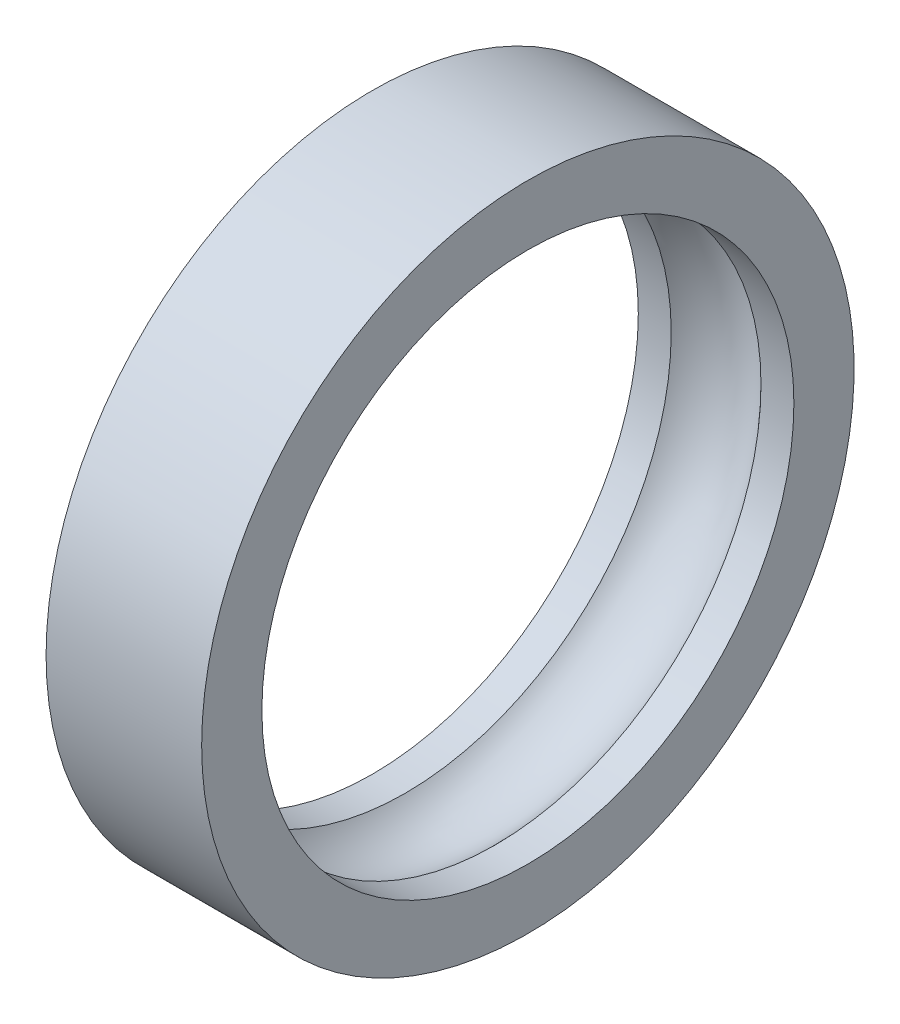
ISO-10303-21;
HEADER;
FILE_DESCRIPTION(('STEP AP214'),'2;1');
FILE_NAME('part.step','',(''),(''),'','','');
FILE_SCHEMA(('AUTOMOTIVE_DESIGN { 1 0 10303 214 1 1 1 1 }'));
ENDSEC;
DATA;
#1=APPLICATION_CONTEXT('core data for automotive mechanical design processes');
#2=APPLICATION_PROTOCOL_DEFINITION('international standard','automotive_design',2000,#1);
#3=PRODUCT_CONTEXT('',#1,'mechanical');
#4=PRODUCT('Part','Part','',(#3));
#5=PRODUCT_RELATED_PRODUCT_CATEGORY('part','',(#4));
#6=PRODUCT_DEFINITION_FORMATION('','',#4);
#7=PRODUCT_DEFINITION_CONTEXT('part definition',#1,'design');
#8=PRODUCT_DEFINITION('design','',#6,#7);
#9=PRODUCT_DEFINITION_SHAPE('','',#8);
#10=(LENGTH_UNIT() NAMED_UNIT(*) SI_UNIT(.MILLI.,.METRE.));
#11=(NAMED_UNIT(*) PLANE_ANGLE_UNIT() SI_UNIT($,.RADIAN.));
#12=(NAMED_UNIT(*) SI_UNIT($,.STERADIAN.) SOLID_ANGLE_UNIT());
#13=UNCERTAINTY_MEASURE_WITH_UNIT(LENGTH_MEASURE(1.E-05),#10,'distance_accuracy_value','');
#14=(GEOMETRIC_REPRESENTATION_CONTEXT(3) GLOBAL_UNCERTAINTY_ASSIGNED_CONTEXT((#13)) GLOBAL_UNIT_ASSIGNED_CONTEXT((#10,
#11,#12)) REPRESENTATION_CONTEXT('',''));
#15=CARTESIAN_POINT('',(0.,0.,0.));
#16=DIRECTION('',(0.,0.,1.));
#17=DIRECTION('',(1.,0.,0.));
#18=AXIS2_PLACEMENT_3D('',#15,#16,#17);
#19=CARTESIAN_POINT('',(-15.5,65.,0.));
#20=DIRECTION('',(1.,0.,0.));
#21=DIRECTION('',(0.,0.,-1.));
#22=AXIS2_PLACEMENT_3D('',#19,#20,#21);
#23=PLANE('',#22);
#24=CARTESIAN_POINT('',(-15.5,0.,0.));
#25=DIRECTION('',(-1.,0.,0.));
#26=DIRECTION('',(0.,0.,1.));
#27=AXIS2_PLACEMENT_3D('',#24,#25,#26);
#28=CIRCLE('',#27,53.);
#29=CARTESIAN_POINT('',(-15.5,0.,53.));
#30=VERTEX_POINT('',#29);
#31=EDGE_CURVE('E53',#30,#30,#28,.T.);
#32=ORIENTED_EDGE('',*,*,#31,.F.);
#33=EDGE_LOOP('',(#32));
#34=FACE_BOUND('',#33,.T.);
#35=CARTESIAN_POINT('',(-15.5,0.,0.));
#36=DIRECTION('',(-1.,0.,0.));
#37=DIRECTION('',(0.,0.,1.));
#38=AXIS2_PLACEMENT_3D('',#35,#36,#37);
#39=CIRCLE('',#38,65.);
#40=CARTESIAN_POINT('',(-15.5,0.,65.));
#41=VERTEX_POINT('',#40);
#42=EDGE_CURVE('E10',#41,#41,#39,.T.);
#43=ORIENTED_EDGE('',*,*,#42,.T.);
#44=EDGE_LOOP('',(#43));
#45=FACE_BOUND('',#44,.T.);
#46=ADVANCED_FACE('F31',(#34,#45),#23,.F.);
#47=CARTESIAN_POINT('',(0.,0.,0.));
#48=DIRECTION('',(-1.,0.,0.));
#49=DIRECTION('',(0.,0.,1.));
#50=AXIS2_PLACEMENT_3D('',#47,#48,#49);
#51=CYLINDRICAL_SURFACE('',#50,65.);
#52=ORIENTED_EDGE('',*,*,#42,.F.);
#53=EDGE_LOOP('',(#52));
#54=FACE_BOUND('',#53,.T.);
#55=CARTESIAN_POINT('',(15.5,0.,0.));
#56=DIRECTION('',(-1.,0.,0.));
#57=DIRECTION('',(0.,0.,1.));
#58=AXIS2_PLACEMENT_3D('',#55,#56,#57);
#59=CIRCLE('',#58,65.);
#60=CARTESIAN_POINT('',(15.5,0.,65.));
#61=VERTEX_POINT('',#60);
#62=EDGE_CURVE('E37',#61,#61,#59,.T.);
#63=ORIENTED_EDGE('',*,*,#62,.T.);
#64=EDGE_LOOP('',(#63));
#65=FACE_BOUND('',#64,.T.);
#66=ADVANCED_FACE('F60',(#54,#65),#51,.T.);
#67=CARTESIAN_POINT('',(15.5,65.,0.));
#68=DIRECTION('',(-1.,0.,0.));
#69=DIRECTION('',(0.,0.,1.));
#70=AXIS2_PLACEMENT_3D('',#67,#68,#69);
#71=PLANE('',#70);
#72=ORIENTED_EDGE('',*,*,#62,.F.);
#73=EDGE_LOOP('',(#72));
#74=FACE_BOUND('',#73,.T.);
#75=CARTESIAN_POINT('',(15.5,0.,0.));
#76=DIRECTION('',(-1.,0.,0.));
#77=DIRECTION('',(0.,0.,1.));
#78=AXIS2_PLACEMENT_3D('',#75,#76,#77);
#79=CIRCLE('',#78,53.);
#80=CARTESIAN_POINT('',(15.5,0.,53.));
#81=VERTEX_POINT('',#80);
#82=EDGE_CURVE('E41',#81,#81,#79,.T.);
#83=ORIENTED_EDGE('',*,*,#82,.T.);
#84=EDGE_LOOP('',(#83));
#85=FACE_BOUND('',#84,.T.);
#86=ADVANCED_FACE('F64',(#74,#85),#71,.F.);
#87=CARTESIAN_POINT('',(0.,0.,0.));
#88=DIRECTION('',(-1.,0.,0.));
#89=DIRECTION('',(0.,0.,1.));
#90=AXIS2_PLACEMENT_3D('',#87,#88,#89);
#91=CYLINDRICAL_SURFACE('',#90,53.);
#92=ORIENTED_EDGE('',*,*,#82,.F.);
#93=EDGE_LOOP('',(#92));
#94=FACE_BOUND('',#93,.T.);
#95=CARTESIAN_POINT('',(8.94427190999916,0.,0.));
#96=DIRECTION('',(-1.,0.,0.));
#97=DIRECTION('',(0.,0.,1.));
#98=AXIS2_PLACEMENT_3D('',#95,#96,#97);
#99=CIRCLE('',#98,53.);
#100=CARTESIAN_POINT('',(8.94427190999916,0.,53.));
#101=VERTEX_POINT('',#100);
#102=EDGE_CURVE('E45',#101,#101,#99,.T.);
#103=ORIENTED_EDGE('',*,*,#102,.T.);
#104=EDGE_LOOP('',(#103));
#105=FACE_BOUND('',#104,.T.);
#106=ADVANCED_FACE('F69',(#94,#105),#91,.F.);
#107=CARTESIAN_POINT('',(0.,0.,0.));
#108=DIRECTION('',(-1.,0.,0.));
#109=DIRECTION('',(0.,0.,1.));
#110=AXIS2_PLACEMENT_3D('',#107,#108,#109);
#111=TOROIDAL_SURFACE('',#110,45.,12.);
#112=ORIENTED_EDGE('',*,*,#102,.F.);
#113=EDGE_LOOP('',(#112));
#114=FACE_BOUND('',#113,.T.);
#115=CARTESIAN_POINT('',(-8.94427190999915,0.,0.));
#116=DIRECTION('',(-1.,0.,0.));
#117=DIRECTION('',(0.,0.,1.));
#118=AXIS2_PLACEMENT_3D('',#115,#116,#117);
#119=CIRCLE('',#118,53.);
#120=CARTESIAN_POINT('',(-8.94427190999915,0.,53.));
#121=VERTEX_POINT('',#120);
#122=EDGE_CURVE('E50',#121,#121,#119,.T.);
#123=ORIENTED_EDGE('',*,*,#122,.T.);
#124=EDGE_LOOP('',(#123));
#125=FACE_BOUND('',#124,.T.);
#126=ADVANCED_FACE('F75',(#114,#125),#111,.F.);
#127=CARTESIAN_POINT('',(0.,0.,0.));
#128=DIRECTION('',(-1.,0.,0.));
#129=DIRECTION('',(0.,0.,1.));
#130=AXIS2_PLACEMENT_3D('',#127,#128,#129);
#131=CYLINDRICAL_SURFACE('',#130,53.);
#132=ORIENTED_EDGE('',*,*,#122,.F.);
#133=EDGE_LOOP('',(#132));
#134=FACE_BOUND('',#133,.T.);
#135=ORIENTED_EDGE('',*,*,#31,.T.);
#136=EDGE_LOOP('',(#135));
#137=FACE_BOUND('',#136,.T.);
#138=ADVANCED_FACE('F57',(#134,#137),#131,.F.);
#139=CLOSED_SHELL('',(#46,#66,#86,#106,#126,#138));
#140=MANIFOLD_SOLID_BREP('B2',#139);
#141=ADVANCED_BREP_SHAPE_REPRESENTATION('',(#18,#140),#14);
#142=SHAPE_DEFINITION_REPRESENTATION(#9,#141);
ENDSEC;
END-ISO-10303-21;
